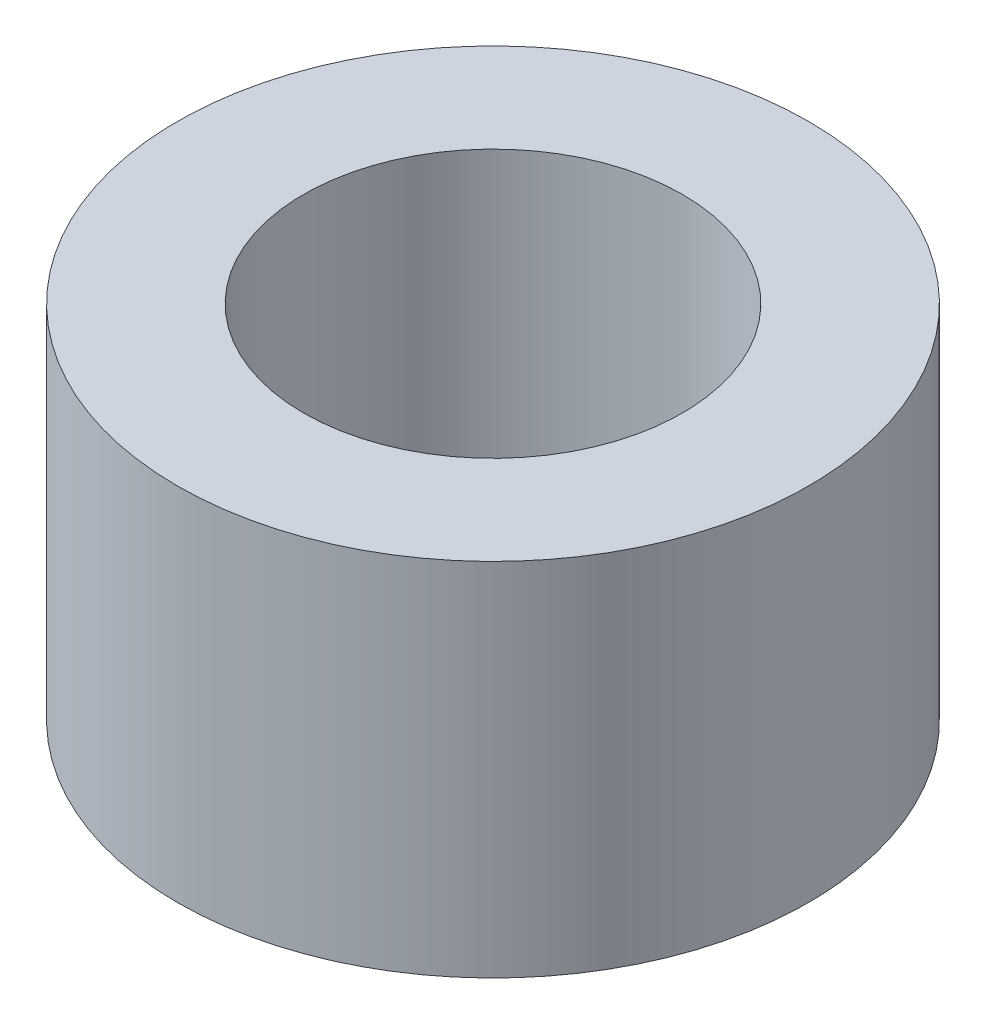
ISO-10303-21;
HEADER;
FILE_DESCRIPTION(('STEP AP214'),'2;1');
FILE_NAME('part.step','',(''),(''),'','','');
FILE_SCHEMA(('AUTOMOTIVE_DESIGN { 1 0 10303 214 1 1 1 1 }'));
ENDSEC;
DATA;
#1=APPLICATION_CONTEXT('core data for automotive mechanical design processes');
#2=APPLICATION_PROTOCOL_DEFINITION('international standard','automotive_design',2000,#1);
#3=PRODUCT_CONTEXT('',#1,'mechanical');
#4=PRODUCT('Part','Part','',(#3));
#5=PRODUCT_RELATED_PRODUCT_CATEGORY('part','',(#4));
#6=PRODUCT_DEFINITION_FORMATION('','',#4);
#7=PRODUCT_DEFINITION_CONTEXT('part definition',#1,'design');
#8=PRODUCT_DEFINITION('design','',#6,#7);
#9=PRODUCT_DEFINITION_SHAPE('','',#8);
#10=(LENGTH_UNIT() NAMED_UNIT(*) SI_UNIT(.MILLI.,.METRE.));
#11=(NAMED_UNIT(*) PLANE_ANGLE_UNIT() SI_UNIT($,.RADIAN.));
#12=(NAMED_UNIT(*) SI_UNIT($,.STERADIAN.) SOLID_ANGLE_UNIT());
#13=UNCERTAINTY_MEASURE_WITH_UNIT(LENGTH_MEASURE(1.E-05),#10,'distance_accuracy_value','');
#14=(GEOMETRIC_REPRESENTATION_CONTEXT(3) GLOBAL_UNCERTAINTY_ASSIGNED_CONTEXT((#13)) GLOBAL_UNIT_ASSIGNED_CONTEXT((#10,
#11,#12)) REPRESENTATION_CONTEXT('',''));
#15=CARTESIAN_POINT('',(0.,0.,0.));
#16=DIRECTION('',(0.,0.,1.));
#17=DIRECTION('',(1.,0.,0.));
#18=AXIS2_PLACEMENT_3D('',#15,#16,#17);
#19=CARTESIAN_POINT('',(0.,4.,0.));
#20=DIRECTION('',(0.,1.,0.));
#21=DIRECTION('',(0.,0.,1.));
#22=AXIS2_PLACEMENT_3D('',#19,#20,#21);
#23=PLANE('',#22);
#24=CARTESIAN_POINT('',(0.,4.,0.));
#25=DIRECTION('',(0.,1.,0.));
#26=DIRECTION('',(0.,0.,1.));
#27=AXIS2_PLACEMENT_3D('',#24,#25,#26);
#28=CIRCLE('',#27,3.5);
#29=CARTESIAN_POINT('',(0.,4.,3.5));
#30=VERTEX_POINT('',#29);
#31=EDGE_CURVE('E10',#30,#30,#28,.T.);
#32=ORIENTED_EDGE('',*,*,#31,.T.);
#33=EDGE_LOOP('',(#32));
#34=FACE_BOUND('',#33,.T.);
#35=CARTESIAN_POINT('',(0.,4.,0.));
#36=DIRECTION('',(0.,1.,0.));
#37=DIRECTION('',(0.,0.,1.));
#38=AXIS2_PLACEMENT_3D('',#35,#36,#37);
#39=CIRCLE('',#38,2.1);
#40=CARTESIAN_POINT('',(0.,4.,2.1));
#41=VERTEX_POINT('',#40);
#42=EDGE_CURVE('E46',#41,#41,#39,.T.);
#43=ORIENTED_EDGE('',*,*,#42,.F.);
#44=EDGE_LOOP('',(#43));
#45=FACE_BOUND('',#44,.T.);
#46=ADVANCED_FACE('F35',(#34,#45),#23,.T.);
#47=CARTESIAN_POINT('',(0.,0.,0.));
#48=DIRECTION('',(0.,1.,0.));
#49=DIRECTION('',(0.,0.,1.));
#50=AXIS2_PLACEMENT_3D('',#47,#48,#49);
#51=PLANE('',#50);
#52=CARTESIAN_POINT('',(0.,0.,0.));
#53=DIRECTION('',(0.,1.,0.));
#54=DIRECTION('',(0.,0.,1.));
#55=AXIS2_PLACEMENT_3D('',#52,#53,#54);
#56=CIRCLE('',#55,3.5);
#57=CARTESIAN_POINT('',(0.,0.,3.5));
#58=VERTEX_POINT('',#57);
#59=EDGE_CURVE('E39',#58,#58,#56,.T.);
#60=ORIENTED_EDGE('',*,*,#59,.F.);
#61=EDGE_LOOP('',(#60));
#62=FACE_BOUND('',#61,.T.);
#63=CARTESIAN_POINT('',(0.,0.,0.));
#64=DIRECTION('',(0.,1.,0.));
#65=DIRECTION('',(0.,0.,1.));
#66=AXIS2_PLACEMENT_3D('',#63,#64,#65);
#67=CIRCLE('',#66,2.1);
#68=CARTESIAN_POINT('',(0.,0.,2.1));
#69=VERTEX_POINT('',#68);
#70=EDGE_CURVE('E48',#69,#69,#67,.T.);
#71=ORIENTED_EDGE('',*,*,#70,.T.);
#72=EDGE_LOOP('',(#71));
#73=FACE_BOUND('',#72,.T.);
#74=ADVANCED_FACE('F58',(#62,#73),#51,.F.);
#75=CARTESIAN_POINT('',(0.,4.,0.));
#76=DIRECTION('',(0.,-1.,0.));
#77=DIRECTION('',(0.,0.,-1.));
#78=AXIS2_PLACEMENT_3D('',#75,#76,#77);
#79=CYLINDRICAL_SURFACE('',#78,3.5);
#80=ORIENTED_EDGE('',*,*,#31,.F.);
#81=EDGE_LOOP('',(#80));
#82=FACE_BOUND('',#81,.T.);
#83=ORIENTED_EDGE('',*,*,#59,.T.);
#84=EDGE_LOOP('',(#83));
#85=FACE_BOUND('',#84,.T.);
#86=ADVANCED_FACE('F37',(#82,#85),#79,.T.);
#87=CARTESIAN_POINT('',(0.,4.,0.));
#88=DIRECTION('',(0.,-1.,0.));
#89=DIRECTION('',(0.,0.,-1.));
#90=AXIS2_PLACEMENT_3D('',#87,#88,#89);
#91=CYLINDRICAL_SURFACE('',#90,2.1);
#92=ORIENTED_EDGE('',*,*,#42,.T.);
#93=EDGE_LOOP('',(#92));
#94=FACE_BOUND('',#93,.T.);
#95=ORIENTED_EDGE('',*,*,#70,.F.);
#96=EDGE_LOOP('',(#95));
#97=FACE_BOUND('',#96,.T.);
#98=ADVANCED_FACE('F54',(#94,#97),#91,.F.);
#99=CLOSED_SHELL('',(#46,#74,#86,#98));
#100=MANIFOLD_SOLID_BREP('B2',#99);
#101=ADVANCED_BREP_SHAPE_REPRESENTATION('',(#18,#100),#14);
#102=SHAPE_DEFINITION_REPRESENTATION(#9,#101);
ENDSEC;
END-ISO-10303-21;
